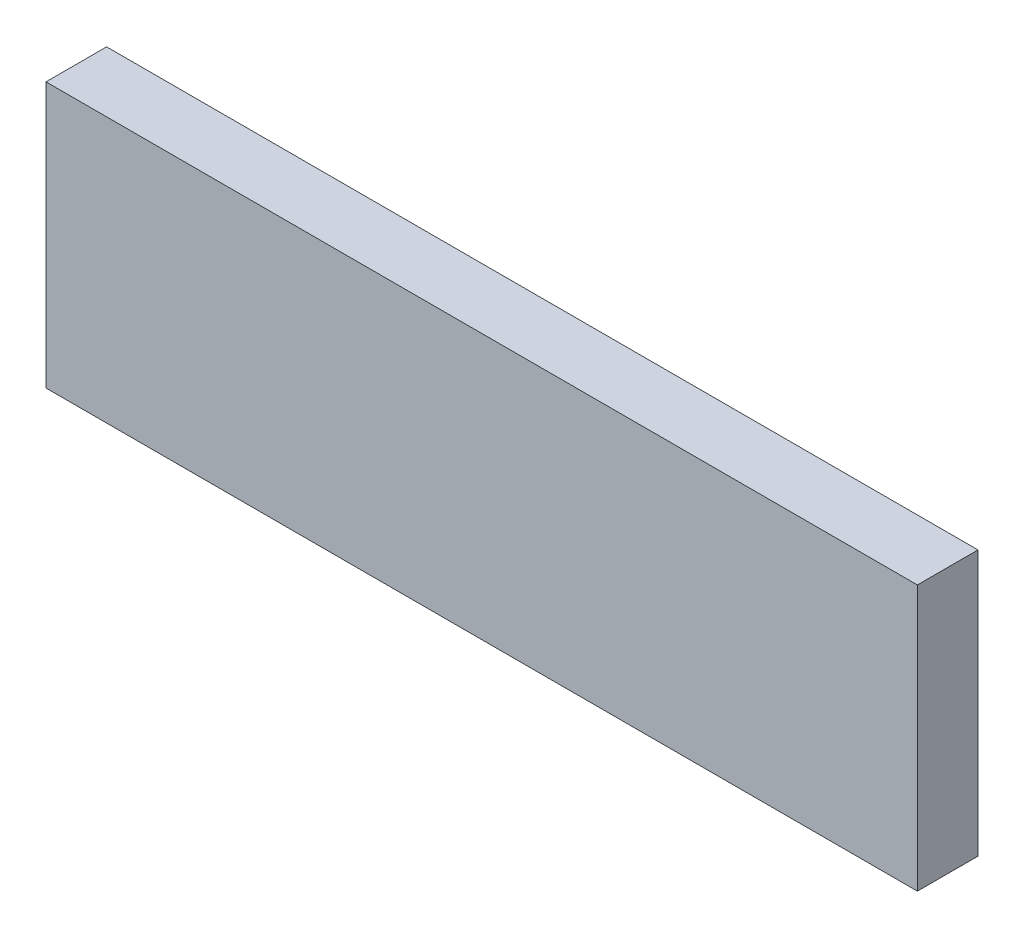
ISO-10303-21;
HEADER;
FILE_DESCRIPTION(('STEP AP214'),'2;1');
FILE_NAME('part.step','',(''),(''),'','','');
FILE_SCHEMA(('AUTOMOTIVE_DESIGN { 1 0 10303 214 1 1 1 1 }'));
ENDSEC;
DATA;
#1=APPLICATION_CONTEXT('core data for automotive mechanical design processes');
#2=APPLICATION_PROTOCOL_DEFINITION('international standard','automotive_design',2000,#1);
#3=PRODUCT_CONTEXT('',#1,'mechanical');
#4=PRODUCT('Part','Part','',(#3));
#5=PRODUCT_RELATED_PRODUCT_CATEGORY('part','',(#4));
#6=PRODUCT_DEFINITION_FORMATION('','',#4);
#7=PRODUCT_DEFINITION_CONTEXT('part definition',#1,'design');
#8=PRODUCT_DEFINITION('design','',#6,#7);
#9=PRODUCT_DEFINITION_SHAPE('','',#8);
#10=(LENGTH_UNIT() NAMED_UNIT(*) SI_UNIT(.MILLI.,.METRE.));
#11=(NAMED_UNIT(*) PLANE_ANGLE_UNIT() SI_UNIT($,.RADIAN.));
#12=(NAMED_UNIT(*) SI_UNIT($,.STERADIAN.) SOLID_ANGLE_UNIT());
#13=UNCERTAINTY_MEASURE_WITH_UNIT(LENGTH_MEASURE(1.E-05),#10,'distance_accuracy_value','');
#14=(GEOMETRIC_REPRESENTATION_CONTEXT(3) GLOBAL_UNCERTAINTY_ASSIGNED_CONTEXT((#13)) GLOBAL_UNIT_ASSIGNED_CONTEXT((#10,
#11,#12)) REPRESENTATION_CONTEXT('',''));
#15=CARTESIAN_POINT('',(0.,0.,0.));
#16=DIRECTION('',(0.,0.,1.));
#17=DIRECTION('',(1.,0.,0.));
#18=AXIS2_PLACEMENT_3D('',#15,#16,#17);
#19=CARTESIAN_POINT('',(-115.,35.,16.));
#20=DIRECTION('',(1.,0.,0.));
#21=DIRECTION('',(0.,1.,0.));
#22=AXIS2_PLACEMENT_3D('',#19,#20,#21);
#23=PLANE('',#22);
#24=DIRECTION('',(0.,-1.,0.));
#25=VECTOR('',#24,1.);
#26=CARTESIAN_POINT('',(-115.,35.,0.));
#27=LINE('',#26,#25);
#28=CARTESIAN_POINT('',(-115.,35.,0.));
#29=VERTEX_POINT('',#28);
#30=CARTESIAN_POINT('',(-115.,-35.,0.));
#31=VERTEX_POINT('',#30);
#32=EDGE_CURVE('E93',#29,#31,#27,.T.);
#33=ORIENTED_EDGE('',*,*,#32,.T.);
#34=DIRECTION('',(0.,0.,-1.));
#35=VECTOR('',#34,1.);
#36=CARTESIAN_POINT('',(-115.,-35.,16.));
#37=LINE('',#36,#35);
#38=CARTESIAN_POINT('',(-115.,-35.,16.));
#39=VERTEX_POINT('',#38);
#40=EDGE_CURVE('E11',#39,#31,#37,.T.);
#41=ORIENTED_EDGE('',*,*,#40,.F.);
#42=DIRECTION('',(0.,-1.,0.));
#43=VECTOR('',#42,1.);
#44=CARTESIAN_POINT('',(-115.,35.,16.));
#45=LINE('',#44,#43);
#46=CARTESIAN_POINT('',(-115.,35.,16.));
#47=VERTEX_POINT('',#46);
#48=EDGE_CURVE('E81',#47,#39,#45,.T.);
#49=ORIENTED_EDGE('',*,*,#48,.F.);
#50=DIRECTION('',(0.,0.,-1.));
#51=VECTOR('',#50,1.);
#52=CARTESIAN_POINT('',(-115.,35.,16.));
#53=LINE('',#52,#51);
#54=EDGE_CURVE('E89',#47,#29,#53,.T.);
#55=ORIENTED_EDGE('',*,*,#54,.T.);
#56=EDGE_LOOP('',(#33,#41,#49,#55));
#57=FACE_BOUND('',#56,.T.);
#58=ADVANCED_FACE('F30',(#57),#23,.F.);
#59=CARTESIAN_POINT('',(-115.,-35.,16.));
#60=DIRECTION('',(0.,1.,0.));
#61=DIRECTION('',(-1.,0.,0.));
#62=AXIS2_PLACEMENT_3D('',#59,#60,#61);
#63=PLANE('',#62);
#64=DIRECTION('',(1.,0.,0.));
#65=VECTOR('',#64,1.);
#66=CARTESIAN_POINT('',(-115.,-35.,0.));
#67=LINE('',#66,#65);
#68=CARTESIAN_POINT('',(115.,-35.,0.));
#69=VERTEX_POINT('',#68);
#70=EDGE_CURVE('E85',#31,#69,#67,.T.);
#71=ORIENTED_EDGE('',*,*,#70,.T.);
#72=DIRECTION('',(0.,0.,-1.));
#73=VECTOR('',#72,1.);
#74=CARTESIAN_POINT('',(115.,-35.,16.));
#75=LINE('',#74,#73);
#76=CARTESIAN_POINT('',(115.,-35.,16.));
#77=VERTEX_POINT('',#76);
#78=EDGE_CURVE('E38',#77,#69,#75,.T.);
#79=ORIENTED_EDGE('',*,*,#78,.F.);
#80=DIRECTION('',(1.,0.,0.));
#81=VECTOR('',#80,1.);
#82=CARTESIAN_POINT('',(-115.,-35.,16.));
#83=LINE('',#82,#81);
#84=EDGE_CURVE('E76',#39,#77,#83,.T.);
#85=ORIENTED_EDGE('',*,*,#84,.F.);
#86=ORIENTED_EDGE('',*,*,#40,.T.);
#87=EDGE_LOOP('',(#71,#79,#85,#86));
#88=FACE_BOUND('',#87,.T.);
#89=ADVANCED_FACE('F84',(#88),#63,.F.);
#90=CARTESIAN_POINT('',(115.,35.,16.));
#91=DIRECTION('',(-1.,0.,0.));
#92=DIRECTION('',(0.,0.,1.));
#93=AXIS2_PLACEMENT_3D('',#90,#91,#92);
#94=PLANE('',#93);
#95=DIRECTION('',(0.,1.,0.));
#96=VECTOR('',#95,1.);
#97=CARTESIAN_POINT('',(115.,35.,0.));
#98=LINE('',#97,#96);
#99=CARTESIAN_POINT('',(115.,35.,0.));
#100=VERTEX_POINT('',#99);
#101=EDGE_CURVE('E63',#69,#100,#98,.T.);
#102=ORIENTED_EDGE('',*,*,#101,.T.);
#103=DIRECTION('',(0.,0.,-1.));
#104=VECTOR('',#103,1.);
#105=CARTESIAN_POINT('',(115.,35.,16.));
#106=LINE('',#105,#104);
#107=CARTESIAN_POINT('',(115.,35.,16.));
#108=VERTEX_POINT('',#107);
#109=EDGE_CURVE('E86',#108,#100,#106,.T.);
#110=ORIENTED_EDGE('',*,*,#109,.F.);
#111=DIRECTION('',(0.,1.,0.));
#112=VECTOR('',#111,1.);
#113=CARTESIAN_POINT('',(115.,35.,16.));
#114=LINE('',#113,#112);
#115=EDGE_CURVE('E79',#77,#108,#114,.T.);
#116=ORIENTED_EDGE('',*,*,#115,.F.);
#117=ORIENTED_EDGE('',*,*,#78,.T.);
#118=EDGE_LOOP('',(#102,#110,#116,#117));
#119=FACE_BOUND('',#118,.T.);
#120=ADVANCED_FACE('F87',(#119),#94,.F.);
#121=CARTESIAN_POINT('',(-115.,35.,16.));
#122=DIRECTION('',(0.,-1.,0.));
#123=DIRECTION('',(0.,0.,-1.));
#124=AXIS2_PLACEMENT_3D('',#121,#122,#123);
#125=PLANE('',#124);
#126=DIRECTION('',(-1.,0.,0.));
#127=VECTOR('',#126,1.);
#128=CARTESIAN_POINT('',(-115.,35.,0.));
#129=LINE('',#128,#127);
#130=EDGE_CURVE('E69',#100,#29,#129,.T.);
#131=ORIENTED_EDGE('',*,*,#130,.T.);
#132=ORIENTED_EDGE('',*,*,#54,.F.);
#133=DIRECTION('',(-1.,0.,0.));
#134=VECTOR('',#133,1.);
#135=CARTESIAN_POINT('',(-115.,35.,16.));
#136=LINE('',#135,#134);
#137=EDGE_CURVE('E46',#108,#47,#136,.T.);
#138=ORIENTED_EDGE('',*,*,#137,.F.);
#139=ORIENTED_EDGE('',*,*,#109,.T.);
#140=EDGE_LOOP('',(#131,#132,#138,#139));
#141=FACE_BOUND('',#140,.T.);
#142=ADVANCED_FACE('F100',(#141),#125,.F.);
#143=CARTESIAN_POINT('',(-115.,35.,16.));
#144=DIRECTION('',(0.,0.,1.));
#145=DIRECTION('',(1.,0.,0.));
#146=AXIS2_PLACEMENT_3D('',#143,#144,#145);
#147=PLANE('',#146);
#148=ORIENTED_EDGE('',*,*,#48,.T.);
#149=ORIENTED_EDGE('',*,*,#84,.T.);
#150=ORIENTED_EDGE('',*,*,#115,.T.);
#151=ORIENTED_EDGE('',*,*,#137,.T.);
#152=EDGE_LOOP('',(#148,#149,#150,#151));
#153=FACE_BOUND('',#152,.T.);
#154=ADVANCED_FACE('F77',(#153),#147,.T.);
#155=CARTESIAN_POINT('',(-115.,35.,0.));
#156=DIRECTION('',(0.,0.,1.));
#157=DIRECTION('',(1.,0.,0.));
#158=AXIS2_PLACEMENT_3D('',#155,#156,#157);
#159=PLANE('',#158);
#160=ORIENTED_EDGE('',*,*,#32,.F.);
#161=ORIENTED_EDGE('',*,*,#130,.F.);
#162=ORIENTED_EDGE('',*,*,#101,.F.);
#163=ORIENTED_EDGE('',*,*,#70,.F.);
#164=EDGE_LOOP('',(#160,#161,#162,#163));
#165=FACE_BOUND('',#164,.T.);
#166=ADVANCED_FACE('F103',(#165),#159,.F.);
#167=CLOSED_SHELL('',(#58,#89,#120,#142,#154,#166));
#168=MANIFOLD_SOLID_BREP('B2',#167);
#169=ADVANCED_BREP_SHAPE_REPRESENTATION('',(#18,#168),#14);
#170=SHAPE_DEFINITION_REPRESENTATION(#9,#169);
ENDSEC;
END-ISO-10303-21;
